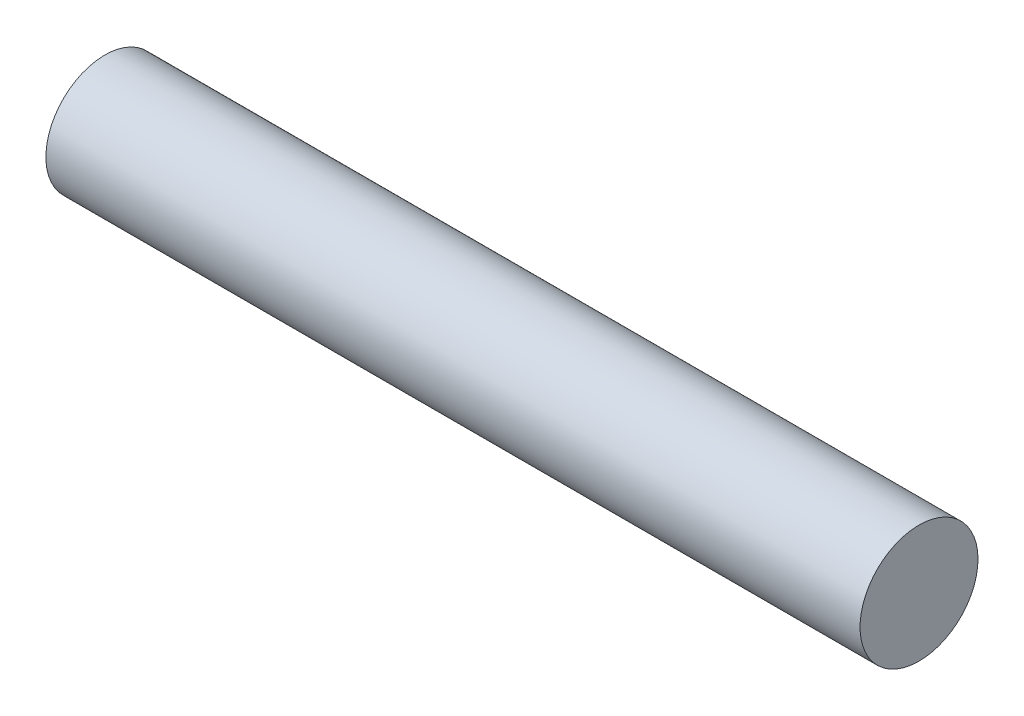
ISO-10303-21;
HEADER;
FILE_DESCRIPTION(('STEP AP214'),'2;1');
FILE_NAME('part.step','',(''),(''),'','','');
FILE_SCHEMA(('AUTOMOTIVE_DESIGN { 1 0 10303 214 1 1 1 1 }'));
ENDSEC;
DATA;
#1=APPLICATION_CONTEXT('core data for automotive mechanical design processes');
#2=APPLICATION_PROTOCOL_DEFINITION('international standard','automotive_design',2000,#1);
#3=PRODUCT_CONTEXT('',#1,'mechanical');
#4=PRODUCT('Part','Part','',(#3));
#5=PRODUCT_RELATED_PRODUCT_CATEGORY('part','',(#4));
#6=PRODUCT_DEFINITION_FORMATION('','',#4);
#7=PRODUCT_DEFINITION_CONTEXT('part definition',#1,'design');
#8=PRODUCT_DEFINITION('design','',#6,#7);
#9=PRODUCT_DEFINITION_SHAPE('','',#8);
#10=(LENGTH_UNIT() NAMED_UNIT(*) SI_UNIT(.MILLI.,.METRE.));
#11=(NAMED_UNIT(*) PLANE_ANGLE_UNIT() SI_UNIT($,.RADIAN.));
#12=(NAMED_UNIT(*) SI_UNIT($,.STERADIAN.) SOLID_ANGLE_UNIT());
#13=UNCERTAINTY_MEASURE_WITH_UNIT(LENGTH_MEASURE(1.E-05),#10,'distance_accuracy_value','');
#14=(GEOMETRIC_REPRESENTATION_CONTEXT(3) GLOBAL_UNCERTAINTY_ASSIGNED_CONTEXT((#13)) GLOBAL_UNIT_ASSIGNED_CONTEXT((#10,
#11,#12)) REPRESENTATION_CONTEXT('',''));
#15=CARTESIAN_POINT('',(0.,0.,0.));
#16=DIRECTION('',(0.,0.,1.));
#17=DIRECTION('',(1.,0.,0.));
#18=AXIS2_PLACEMENT_3D('',#15,#16,#17);
#19=CARTESIAN_POINT('',(20.71,0.,0.));
#20=DIRECTION('',(-1.,0.,0.));
#21=DIRECTION('',(0.,0.,1.));
#22=AXIS2_PLACEMENT_3D('',#19,#20,#21);
#23=CYLINDRICAL_SURFACE('',#22,1.5);
#24=CARTESIAN_POINT('',(20.71,0.,0.));
#25=DIRECTION('',(1.,0.,0.));
#26=DIRECTION('',(0.,0.,-1.));
#27=AXIS2_PLACEMENT_3D('',#24,#25,#26);
#28=CIRCLE('',#27,1.5);
#29=CARTESIAN_POINT('',(20.71,0.,-1.5));
#30=VERTEX_POINT('',#29);
#31=EDGE_CURVE('E10',#30,#30,#28,.T.);
#32=ORIENTED_EDGE('',*,*,#31,.F.);
#33=EDGE_LOOP('',(#32));
#34=FACE_BOUND('',#33,.T.);
#35=CARTESIAN_POINT('',(0.,0.,0.));
#36=DIRECTION('',(1.,0.,0.));
#37=DIRECTION('',(0.,0.,-1.));
#38=AXIS2_PLACEMENT_3D('',#35,#36,#37);
#39=CIRCLE('',#38,1.5);
#40=CARTESIAN_POINT('',(0.,0.,-1.5));
#41=VERTEX_POINT('',#40);
#42=EDGE_CURVE('E36',#41,#41,#39,.T.);
#43=ORIENTED_EDGE('',*,*,#42,.T.);
#44=EDGE_LOOP('',(#43));
#45=FACE_BOUND('',#44,.T.);
#46=ADVANCED_FACE('F33',(#34,#45),#23,.T.);
#47=CARTESIAN_POINT('',(20.71,0.,0.));
#48=DIRECTION('',(1.,0.,0.));
#49=DIRECTION('',(0.,0.,-1.));
#50=AXIS2_PLACEMENT_3D('',#47,#48,#49);
#51=PLANE('',#50);
#52=ORIENTED_EDGE('',*,*,#31,.T.);
#53=EDGE_LOOP('',(#52));
#54=FACE_BOUND('',#53,.T.);
#55=ADVANCED_FACE('F48',(#54),#51,.T.);
#56=CARTESIAN_POINT('',(0.,0.,0.));
#57=DIRECTION('',(1.,0.,0.));
#58=DIRECTION('',(0.,0.,-1.));
#59=AXIS2_PLACEMENT_3D('',#56,#57,#58);
#60=PLANE('',#59);
#61=ORIENTED_EDGE('',*,*,#42,.F.);
#62=EDGE_LOOP('',(#61));
#63=FACE_BOUND('',#62,.T.);
#64=ADVANCED_FACE('F46',(#63),#60,.F.);
#65=CLOSED_SHELL('',(#46,#55,#64));
#66=MANIFOLD_SOLID_BREP('B2',#65);
#67=ADVANCED_BREP_SHAPE_REPRESENTATION('',(#18,#66),#14);
#68=SHAPE_DEFINITION_REPRESENTATION(#9,#67);
ENDSEC;
END-ISO-10303-21;
